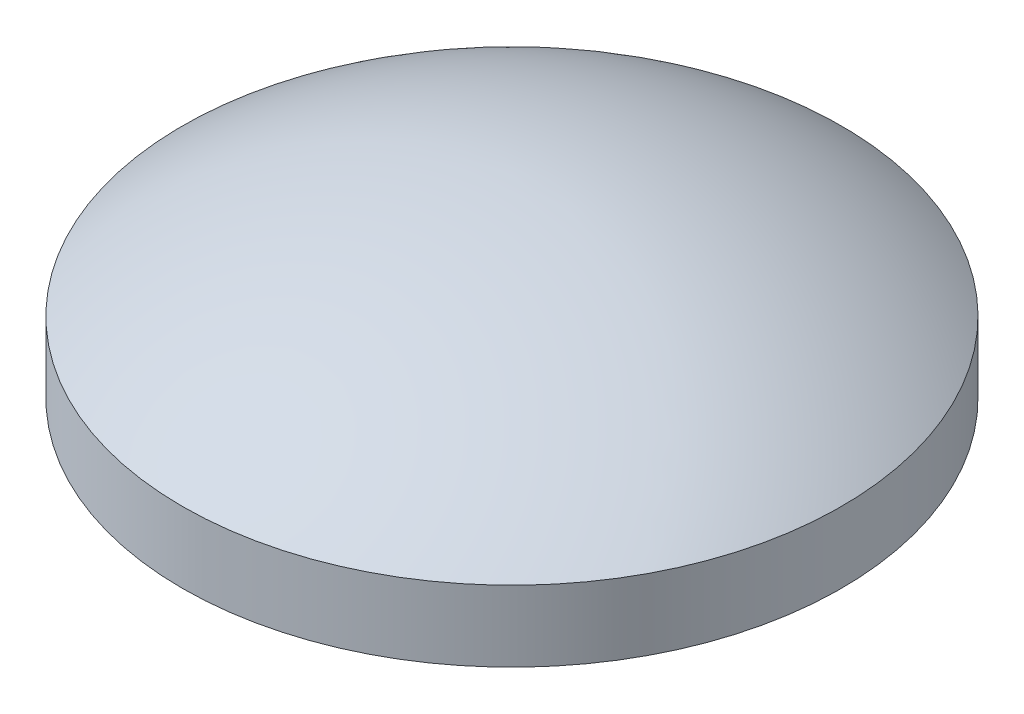
ISO-10303-21;
HEADER;
FILE_DESCRIPTION(('STEP AP214'),'2;1');
FILE_NAME('part.step','',(''),(''),'','','');
FILE_SCHEMA(('AUTOMOTIVE_DESIGN { 1 0 10303 214 1 1 1 1 }'));
ENDSEC;
DATA;
#1=APPLICATION_CONTEXT('core data for automotive mechanical design processes');
#2=APPLICATION_PROTOCOL_DEFINITION('international standard','automotive_design',2000,#1);
#3=PRODUCT_CONTEXT('',#1,'mechanical');
#4=PRODUCT('Part','Part','',(#3));
#5=PRODUCT_RELATED_PRODUCT_CATEGORY('part','',(#4));
#6=PRODUCT_DEFINITION_FORMATION('','',#4);
#7=PRODUCT_DEFINITION_CONTEXT('part definition',#1,'design');
#8=PRODUCT_DEFINITION('design','',#6,#7);
#9=PRODUCT_DEFINITION_SHAPE('','',#8);
#10=(LENGTH_UNIT() NAMED_UNIT(*) SI_UNIT(.MILLI.,.METRE.));
#11=(NAMED_UNIT(*) PLANE_ANGLE_UNIT() SI_UNIT($,.RADIAN.));
#12=(NAMED_UNIT(*) SI_UNIT($,.STERADIAN.) SOLID_ANGLE_UNIT());
#13=UNCERTAINTY_MEASURE_WITH_UNIT(LENGTH_MEASURE(1.E-05),#10,'distance_accuracy_value','');
#14=(GEOMETRIC_REPRESENTATION_CONTEXT(3) GLOBAL_UNCERTAINTY_ASSIGNED_CONTEXT((#13)) GLOBAL_UNIT_ASSIGNED_CONTEXT((#10,
#11,#12)) REPRESENTATION_CONTEXT('',''));
#15=CARTESIAN_POINT('',(0.,0.,0.));
#16=DIRECTION('',(0.,0.,1.));
#17=DIRECTION('',(1.,0.,0.));
#18=AXIS2_PLACEMENT_3D('',#15,#16,#17);
#19=CARTESIAN_POINT('',(0.,-3.55113636363636,0.));
#20=DIRECTION('',(1.,0.,0.));
#21=DIRECTION('',(0.,-1.,0.));
#22=AXIS2_PLACEMENT_3D('',#19,#20,#21);
#23=SPHERICAL_SURFACE('',#22,5.35113636363636);
#24=CARTESIAN_POINT('',(0.,0.699999999999999,0.));
#25=DIRECTION('',(0.,1.,0.));
#26=DIRECTION('',(0.,0.,1.));
#27=AXIS2_PLACEMENT_3D('',#24,#25,#26);
#28=CIRCLE('',#27,3.25);
#29=CARTESIAN_POINT('',(0.,0.699999999999999,3.25));
#30=VERTEX_POINT('',#29);
#31=EDGE_CURVE('E19',#30,#30,#28,.F.);
#32=ORIENTED_EDGE('',*,*,#31,.F.);
#33=EDGE_LOOP('',(#32));
#34=FACE_BOUND('',#33,.T.);
#35=ADVANCED_FACE('F15',(#34),#23,.T.);
#36=CARTESIAN_POINT('',(0.,18.2966101694915,0.));
#37=DIRECTION('',(0.,1.,0.));
#38=DIRECTION('',(0.,0.,1.));
#39=AXIS2_PLACEMENT_3D('',#36,#37,#38);
#40=CYLINDRICAL_SURFACE('',#39,3.25);
#41=ORIENTED_EDGE('',*,*,#31,.T.);
#42=EDGE_LOOP('',(#41));
#43=FACE_BOUND('',#42,.T.);
#44=CARTESIAN_POINT('',(0.,0.,0.));
#45=DIRECTION('',(0.,1.,0.));
#46=DIRECTION('',(0.,0.,1.));
#47=AXIS2_PLACEMENT_3D('',#44,#45,#46);
#48=CIRCLE('',#47,3.25);
#49=CARTESIAN_POINT('',(0.,0.,3.25));
#50=VERTEX_POINT('',#49);
#51=EDGE_CURVE('E10',#50,#50,#48,.T.);
#52=ORIENTED_EDGE('',*,*,#51,.T.);
#53=EDGE_LOOP('',(#52));
#54=FACE_BOUND('',#53,.T.);
#55=ADVANCED_FACE('F29',(#43,#54),#40,.T.);
#56=CARTESIAN_POINT('',(0.,0.,0.));
#57=DIRECTION('',(0.,1.,0.));
#58=DIRECTION('',(0.,0.,1.));
#59=AXIS2_PLACEMENT_3D('',#56,#57,#58);
#60=PLANE('',#59);
#61=ORIENTED_EDGE('',*,*,#51,.F.);
#62=EDGE_LOOP('',(#61));
#63=FACE_BOUND('',#62,.T.);
#64=ADVANCED_FACE('F36',(#63),#60,.F.);
#65=CLOSED_SHELL('',(#35,#55,#64));
#66=MANIFOLD_SOLID_BREP('B1',#65);
#67=ADVANCED_BREP_SHAPE_REPRESENTATION('',(#18,#66),#14);
#68=SHAPE_DEFINITION_REPRESENTATION(#9,#67);
ENDSEC;
END-ISO-10303-21;
